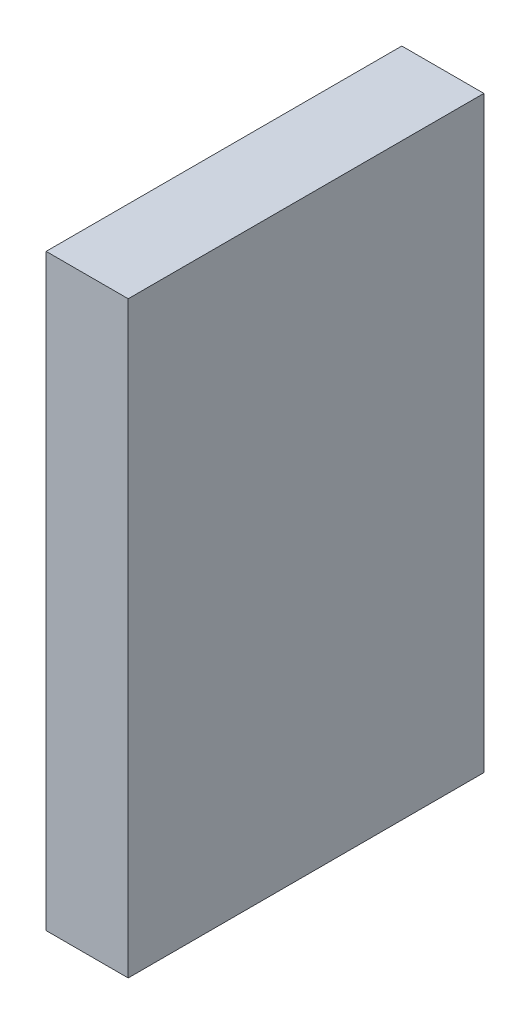
ISO-10303-21;
HEADER;
FILE_DESCRIPTION(('STEP AP214'),'2;1');
FILE_NAME('part.step','',(''),(''),'','','');
FILE_SCHEMA(('AUTOMOTIVE_DESIGN { 1 0 10303 214 1 1 1 1 }'));
ENDSEC;
DATA;
#1=APPLICATION_CONTEXT('core data for automotive mechanical design processes');
#2=APPLICATION_PROTOCOL_DEFINITION('international standard','automotive_design',2000,#1);
#3=PRODUCT_CONTEXT('',#1,'mechanical');
#4=PRODUCT('Part','Part','',(#3));
#5=PRODUCT_RELATED_PRODUCT_CATEGORY('part','',(#4));
#6=PRODUCT_DEFINITION_FORMATION('','',#4);
#7=PRODUCT_DEFINITION_CONTEXT('part definition',#1,'design');
#8=PRODUCT_DEFINITION('design','',#6,#7);
#9=PRODUCT_DEFINITION_SHAPE('','',#8);
#10=(LENGTH_UNIT() NAMED_UNIT(*) SI_UNIT(.MILLI.,.METRE.));
#11=(NAMED_UNIT(*) PLANE_ANGLE_UNIT() SI_UNIT($,.RADIAN.));
#12=(NAMED_UNIT(*) SI_UNIT($,.STERADIAN.) SOLID_ANGLE_UNIT());
#13=UNCERTAINTY_MEASURE_WITH_UNIT(LENGTH_MEASURE(1.E-05),#10,'distance_accuracy_value','');
#14=(GEOMETRIC_REPRESENTATION_CONTEXT(3) GLOBAL_UNCERTAINTY_ASSIGNED_CONTEXT((#13)) GLOBAL_UNIT_ASSIGNED_CONTEXT((#10,
#11,#12)) REPRESENTATION_CONTEXT('',''));
#15=CARTESIAN_POINT('',(0.,0.,0.));
#16=DIRECTION('',(0.,0.,1.));
#17=DIRECTION('',(1.,0.,0.));
#18=AXIS2_PLACEMENT_3D('',#15,#16,#17);
#19=CARTESIAN_POINT('',(0.,21.5,0.));
#20=DIRECTION('',(1.,0.,0.));
#21=DIRECTION('',(0.,0.,-1.));
#22=AXIS2_PLACEMENT_3D('',#19,#20,#21);
#23=PLANE('',#22);
#24=DIRECTION('',(0.,0.,1.));
#25=VECTOR('',#24,1.);
#26=CARTESIAN_POINT('',(0.,0.,0.));
#27=LINE('',#26,#25);
#28=CARTESIAN_POINT('',(0.,0.,-13.));
#29=VERTEX_POINT('',#28);
#30=CARTESIAN_POINT('',(0.,0.,0.));
#31=VERTEX_POINT('',#30);
#32=EDGE_CURVE('E96',#29,#31,#27,.T.);
#33=ORIENTED_EDGE('',*,*,#32,.T.);
#34=DIRECTION('',(0.,-1.,0.));
#35=VECTOR('',#34,1.);
#36=CARTESIAN_POINT('',(0.,21.5,0.));
#37=LINE('',#36,#35);
#38=CARTESIAN_POINT('',(0.,21.5,0.));
#39=VERTEX_POINT('',#38);
#40=EDGE_CURVE('E11',#39,#31,#37,.T.);
#41=ORIENTED_EDGE('',*,*,#40,.F.);
#42=DIRECTION('',(0.,0.,1.));
#43=VECTOR('',#42,1.);
#44=CARTESIAN_POINT('',(0.,21.5,0.));
#45=LINE('',#44,#43);
#46=CARTESIAN_POINT('',(0.,21.5,-13.));
#47=VERTEX_POINT('',#46);
#48=EDGE_CURVE('E84',#47,#39,#45,.T.);
#49=ORIENTED_EDGE('',*,*,#48,.F.);
#50=DIRECTION('',(0.,-1.,0.));
#51=VECTOR('',#50,1.);
#52=CARTESIAN_POINT('',(0.,21.5,-13.));
#53=LINE('',#52,#51);
#54=EDGE_CURVE('E92',#47,#29,#53,.T.);
#55=ORIENTED_EDGE('',*,*,#54,.T.);
#56=EDGE_LOOP('',(#33,#41,#49,#55));
#57=FACE_BOUND('',#56,.T.);
#58=ADVANCED_FACE('F33',(#57),#23,.F.);
#59=CARTESIAN_POINT('',(0.,21.5,0.));
#60=DIRECTION('',(0.,0.,-1.));
#61=DIRECTION('',(-1.,0.,0.));
#62=AXIS2_PLACEMENT_3D('',#59,#60,#61);
#63=PLANE('',#62);
#64=DIRECTION('',(1.,0.,0.));
#65=VECTOR('',#64,1.);
#66=CARTESIAN_POINT('',(0.,0.,0.));
#67=LINE('',#66,#65);
#68=CARTESIAN_POINT('',(3.,0.,0.));
#69=VERTEX_POINT('',#68);
#70=EDGE_CURVE('E88',#31,#69,#67,.T.);
#71=ORIENTED_EDGE('',*,*,#70,.T.);
#72=DIRECTION('',(0.,-1.,0.));
#73=VECTOR('',#72,1.);
#74=CARTESIAN_POINT('',(3.,21.5,0.));
#75=LINE('',#74,#73);
#76=CARTESIAN_POINT('',(3.,21.5,0.));
#77=VERTEX_POINT('',#76);
#78=EDGE_CURVE('E41',#77,#69,#75,.T.);
#79=ORIENTED_EDGE('',*,*,#78,.F.);
#80=DIRECTION('',(1.,0.,0.));
#81=VECTOR('',#80,1.);
#82=CARTESIAN_POINT('',(0.,21.5,0.));
#83=LINE('',#82,#81);
#84=EDGE_CURVE('E79',#39,#77,#83,.T.);
#85=ORIENTED_EDGE('',*,*,#84,.F.);
#86=ORIENTED_EDGE('',*,*,#40,.T.);
#87=EDGE_LOOP('',(#71,#79,#85,#86));
#88=FACE_BOUND('',#87,.T.);
#89=ADVANCED_FACE('F87',(#88),#63,.F.);
#90=CARTESIAN_POINT('',(3.,21.5,0.));
#91=DIRECTION('',(-1.,0.,0.));
#92=DIRECTION('',(0.,0.,1.));
#93=AXIS2_PLACEMENT_3D('',#90,#91,#92);
#94=PLANE('',#93);
#95=DIRECTION('',(0.,0.,-1.));
#96=VECTOR('',#95,1.);
#97=CARTESIAN_POINT('',(3.,0.,0.));
#98=LINE('',#97,#96);
#99=CARTESIAN_POINT('',(3.,0.,-13.));
#100=VERTEX_POINT('',#99);
#101=EDGE_CURVE('E66',#69,#100,#98,.T.);
#102=ORIENTED_EDGE('',*,*,#101,.T.);
#103=DIRECTION('',(0.,-1.,0.));
#104=VECTOR('',#103,1.);
#105=CARTESIAN_POINT('',(3.,21.5,-13.));
#106=LINE('',#105,#104);
#107=CARTESIAN_POINT('',(3.,21.5,-13.));
#108=VERTEX_POINT('',#107);
#109=EDGE_CURVE('E89',#108,#100,#106,.T.);
#110=ORIENTED_EDGE('',*,*,#109,.F.);
#111=DIRECTION('',(0.,0.,-1.));
#112=VECTOR('',#111,1.);
#113=CARTESIAN_POINT('',(3.,21.5,0.));
#114=LINE('',#113,#112);
#115=EDGE_CURVE('E82',#77,#108,#114,.T.);
#116=ORIENTED_EDGE('',*,*,#115,.F.);
#117=ORIENTED_EDGE('',*,*,#78,.T.);
#118=EDGE_LOOP('',(#102,#110,#116,#117));
#119=FACE_BOUND('',#118,.T.);
#120=ADVANCED_FACE('F90',(#119),#94,.F.);
#121=CARTESIAN_POINT('',(0.,21.5,-13.));
#122=DIRECTION('',(0.,0.,1.));
#123=DIRECTION('',(1.,0.,0.));
#124=AXIS2_PLACEMENT_3D('',#121,#122,#123);
#125=PLANE('',#124);
#126=DIRECTION('',(-1.,0.,0.));
#127=VECTOR('',#126,1.);
#128=CARTESIAN_POINT('',(0.,0.,-13.));
#129=LINE('',#128,#127);
#130=EDGE_CURVE('E72',#100,#29,#129,.T.);
#131=ORIENTED_EDGE('',*,*,#130,.T.);
#132=ORIENTED_EDGE('',*,*,#54,.F.);
#133=DIRECTION('',(-1.,0.,0.));
#134=VECTOR('',#133,1.);
#135=CARTESIAN_POINT('',(0.,21.5,-13.));
#136=LINE('',#135,#134);
#137=EDGE_CURVE('E49',#108,#47,#136,.T.);
#138=ORIENTED_EDGE('',*,*,#137,.F.);
#139=ORIENTED_EDGE('',*,*,#109,.T.);
#140=EDGE_LOOP('',(#131,#132,#138,#139));
#141=FACE_BOUND('',#140,.T.);
#142=ADVANCED_FACE('F103',(#141),#125,.F.);
#143=CARTESIAN_POINT('',(0.,21.5,0.));
#144=DIRECTION('',(0.,-1.,0.));
#145=DIRECTION('',(0.,0.,-1.));
#146=AXIS2_PLACEMENT_3D('',#143,#144,#145);
#147=PLANE('',#146);
#148=ORIENTED_EDGE('',*,*,#48,.T.);
#149=ORIENTED_EDGE('',*,*,#84,.T.);
#150=ORIENTED_EDGE('',*,*,#115,.T.);
#151=ORIENTED_EDGE('',*,*,#137,.T.);
#152=EDGE_LOOP('',(#148,#149,#150,#151));
#153=FACE_BOUND('',#152,.T.);
#154=ADVANCED_FACE('F80',(#153),#147,.F.);
#155=CARTESIAN_POINT('',(0.,0.,0.));
#156=DIRECTION('',(0.,-1.,0.));
#157=DIRECTION('',(0.,0.,-1.));
#158=AXIS2_PLACEMENT_3D('',#155,#156,#157);
#159=PLANE('',#158);
#160=ORIENTED_EDGE('',*,*,#32,.F.);
#161=ORIENTED_EDGE('',*,*,#130,.F.);
#162=ORIENTED_EDGE('',*,*,#101,.F.);
#163=ORIENTED_EDGE('',*,*,#70,.F.);
#164=EDGE_LOOP('',(#160,#161,#162,#163));
#165=FACE_BOUND('',#164,.T.);
#166=ADVANCED_FACE('F106',(#165),#159,.T.);
#167=CLOSED_SHELL('',(#58,#89,#120,#142,#154,#166));
#168=MANIFOLD_SOLID_BREP('B2',#167);
#169=ADVANCED_BREP_SHAPE_REPRESENTATION('',(#18,#168),#14);
#170=SHAPE_DEFINITION_REPRESENTATION(#9,#169);
ENDSEC;
END-ISO-10303-21;
